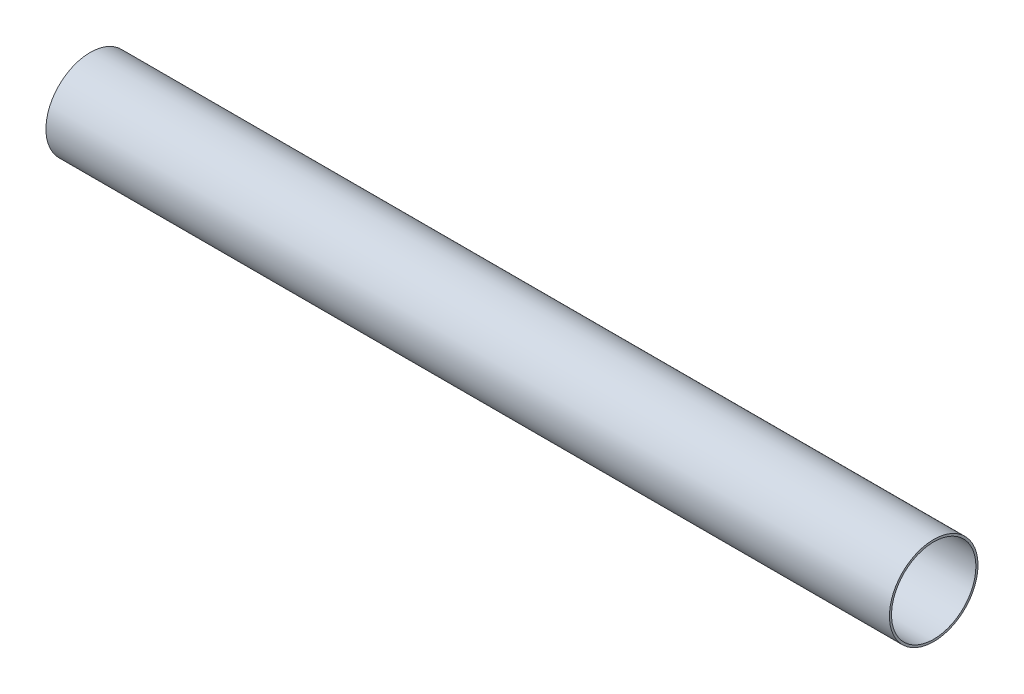
ISO-10303-21;
HEADER;
FILE_DESCRIPTION(('STEP AP214'),'2;1');
FILE_NAME('part.step','',(''),(''),'','','');
FILE_SCHEMA(('AUTOMOTIVE_DESIGN { 1 0 10303 214 1 1 1 1 }'));
ENDSEC;
DATA;
#1=APPLICATION_CONTEXT('core data for automotive mechanical design processes');
#2=APPLICATION_PROTOCOL_DEFINITION('international standard','automotive_design',2000,#1);
#3=PRODUCT_CONTEXT('',#1,'mechanical');
#4=PRODUCT('Part','Part','',(#3));
#5=PRODUCT_RELATED_PRODUCT_CATEGORY('part','',(#4));
#6=PRODUCT_DEFINITION_FORMATION('','',#4);
#7=PRODUCT_DEFINITION_CONTEXT('part definition',#1,'design');
#8=PRODUCT_DEFINITION('design','',#6,#7);
#9=PRODUCT_DEFINITION_SHAPE('','',#8);
#10=(LENGTH_UNIT() NAMED_UNIT(*) SI_UNIT(.MILLI.,.METRE.));
#11=(NAMED_UNIT(*) PLANE_ANGLE_UNIT() SI_UNIT($,.RADIAN.));
#12=(NAMED_UNIT(*) SI_UNIT($,.STERADIAN.) SOLID_ANGLE_UNIT());
#13=UNCERTAINTY_MEASURE_WITH_UNIT(LENGTH_MEASURE(1.E-05),#10,'distance_accuracy_value','');
#14=(GEOMETRIC_REPRESENTATION_CONTEXT(3) GLOBAL_UNCERTAINTY_ASSIGNED_CONTEXT((#13)) GLOBAL_UNIT_ASSIGNED_CONTEXT((#10,
#11,#12)) REPRESENTATION_CONTEXT('',''));
#15=CARTESIAN_POINT('',(0.,0.,0.));
#16=DIRECTION('',(0.,0.,1.));
#17=DIRECTION('',(1.,0.,0.));
#18=AXIS2_PLACEMENT_3D('',#15,#16,#17);
#19=CARTESIAN_POINT('',(500.,0.,0.));
#20=DIRECTION('',(1.,0.,0.));
#21=DIRECTION('',(0.,0.,-1.));
#22=AXIS2_PLACEMENT_3D('',#19,#20,#21);
#23=PLANE('',#22);
#24=CARTESIAN_POINT('',(500.,0.,0.));
#25=DIRECTION('',(1.,0.,0.));
#26=DIRECTION('',(0.,0.,-1.));
#27=AXIS2_PLACEMENT_3D('',#24,#25,#26);
#28=CIRCLE('',#27,52.5);
#29=CARTESIAN_POINT('',(500.,0.,-52.5));
#30=VERTEX_POINT('',#29);
#31=EDGE_CURVE('E10',#30,#30,#28,.T.);
#32=ORIENTED_EDGE('',*,*,#31,.T.);
#33=EDGE_LOOP('',(#32));
#34=FACE_BOUND('',#33,.T.);
#35=CARTESIAN_POINT('',(500.,0.,0.));
#36=DIRECTION('',(1.,0.,0.));
#37=DIRECTION('',(0.,0.,-1.));
#38=AXIS2_PLACEMENT_3D('',#35,#36,#37);
#39=CIRCLE('',#38,50.);
#40=CARTESIAN_POINT('',(500.,0.,-50.));
#41=VERTEX_POINT('',#40);
#42=EDGE_CURVE('E46',#41,#41,#39,.T.);
#43=ORIENTED_EDGE('',*,*,#42,.F.);
#44=EDGE_LOOP('',(#43));
#45=FACE_BOUND('',#44,.T.);
#46=ADVANCED_FACE('F35',(#34,#45),#23,.T.);
#47=CARTESIAN_POINT('',(-500.,0.,0.));
#48=DIRECTION('',(1.,0.,0.));
#49=DIRECTION('',(0.,0.,-1.));
#50=AXIS2_PLACEMENT_3D('',#47,#48,#49);
#51=PLANE('',#50);
#52=CARTESIAN_POINT('',(-500.,0.,0.));
#53=DIRECTION('',(1.,0.,0.));
#54=DIRECTION('',(0.,0.,-1.));
#55=AXIS2_PLACEMENT_3D('',#52,#53,#54);
#56=CIRCLE('',#55,52.5);
#57=CARTESIAN_POINT('',(-500.,0.,-52.5));
#58=VERTEX_POINT('',#57);
#59=EDGE_CURVE('E39',#58,#58,#56,.T.);
#60=ORIENTED_EDGE('',*,*,#59,.F.);
#61=EDGE_LOOP('',(#60));
#62=FACE_BOUND('',#61,.T.);
#63=CARTESIAN_POINT('',(-500.,0.,0.));
#64=DIRECTION('',(1.,0.,0.));
#65=DIRECTION('',(0.,0.,-1.));
#66=AXIS2_PLACEMENT_3D('',#63,#64,#65);
#67=CIRCLE('',#66,50.);
#68=CARTESIAN_POINT('',(-500.,0.,-50.));
#69=VERTEX_POINT('',#68);
#70=EDGE_CURVE('E48',#69,#69,#67,.T.);
#71=ORIENTED_EDGE('',*,*,#70,.T.);
#72=EDGE_LOOP('',(#71));
#73=FACE_BOUND('',#72,.T.);
#74=ADVANCED_FACE('F58',(#62,#73),#51,.F.);
#75=CARTESIAN_POINT('',(500.,0.,0.));
#76=DIRECTION('',(-1.,0.,0.));
#77=DIRECTION('',(0.,0.,1.));
#78=AXIS2_PLACEMENT_3D('',#75,#76,#77);
#79=CYLINDRICAL_SURFACE('',#78,52.5);
#80=ORIENTED_EDGE('',*,*,#31,.F.);
#81=EDGE_LOOP('',(#80));
#82=FACE_BOUND('',#81,.T.);
#83=ORIENTED_EDGE('',*,*,#59,.T.);
#84=EDGE_LOOP('',(#83));
#85=FACE_BOUND('',#84,.T.);
#86=ADVANCED_FACE('F37',(#82,#85),#79,.T.);
#87=CARTESIAN_POINT('',(500.,0.,0.));
#88=DIRECTION('',(-1.,0.,0.));
#89=DIRECTION('',(0.,0.,1.));
#90=AXIS2_PLACEMENT_3D('',#87,#88,#89);
#91=CYLINDRICAL_SURFACE('',#90,50.);
#92=ORIENTED_EDGE('',*,*,#42,.T.);
#93=EDGE_LOOP('',(#92));
#94=FACE_BOUND('',#93,.T.);
#95=ORIENTED_EDGE('',*,*,#70,.F.);
#96=EDGE_LOOP('',(#95));
#97=FACE_BOUND('',#96,.T.);
#98=ADVANCED_FACE('F54',(#94,#97),#91,.F.);
#99=CLOSED_SHELL('',(#46,#74,#86,#98));
#100=MANIFOLD_SOLID_BREP('B2',#99);
#101=ADVANCED_BREP_SHAPE_REPRESENTATION('',(#18,#100),#14);
#102=SHAPE_DEFINITION_REPRESENTATION(#9,#101);
ENDSEC;
END-ISO-10303-21;
